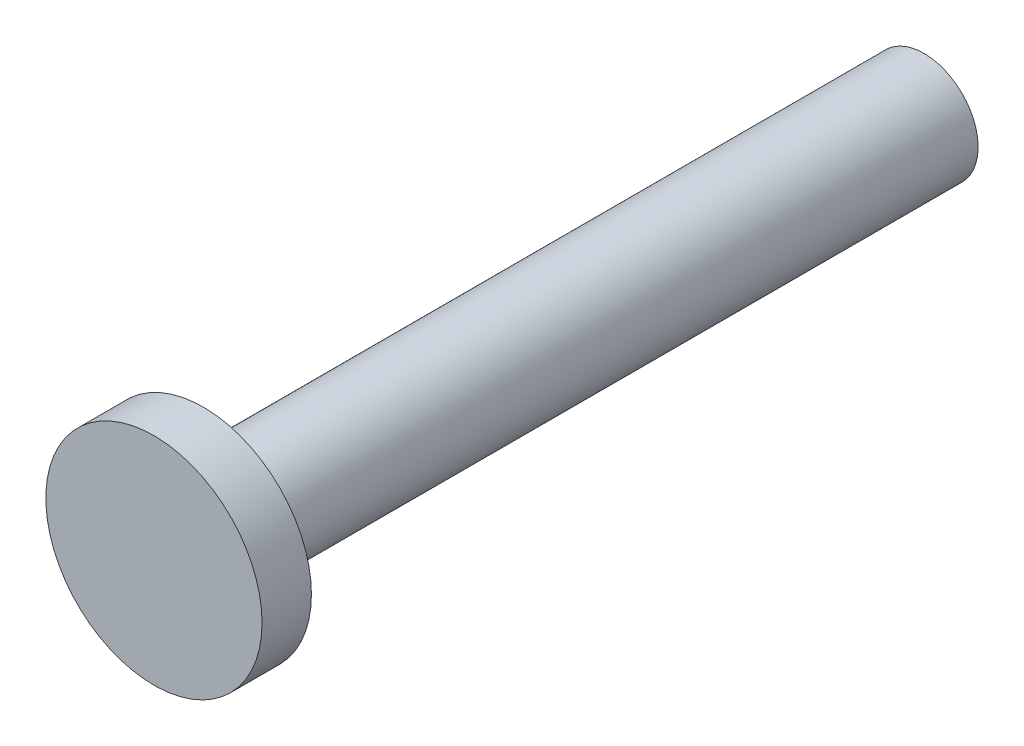
ISO-10303-21;
HEADER;
FILE_DESCRIPTION(('STEP AP214'),'2;1');
FILE_NAME('part.step','',(''),(''),'','','');
FILE_SCHEMA(('AUTOMOTIVE_DESIGN { 1 0 10303 214 1 1 1 1 }'));
ENDSEC;
DATA;
#1=APPLICATION_CONTEXT('core data for automotive mechanical design processes');
#2=APPLICATION_PROTOCOL_DEFINITION('international standard','automotive_design',2000,#1);
#3=PRODUCT_CONTEXT('',#1,'mechanical');
#4=PRODUCT('Part','Part','',(#3));
#5=PRODUCT_RELATED_PRODUCT_CATEGORY('part','',(#4));
#6=PRODUCT_DEFINITION_FORMATION('','',#4);
#7=PRODUCT_DEFINITION_CONTEXT('part definition',#1,'design');
#8=PRODUCT_DEFINITION('design','',#6,#7);
#9=PRODUCT_DEFINITION_SHAPE('','',#8);
#10=(LENGTH_UNIT() NAMED_UNIT(*) SI_UNIT(.MILLI.,.METRE.));
#11=(NAMED_UNIT(*) PLANE_ANGLE_UNIT() SI_UNIT($,.RADIAN.));
#12=(NAMED_UNIT(*) SI_UNIT($,.STERADIAN.) SOLID_ANGLE_UNIT());
#13=UNCERTAINTY_MEASURE_WITH_UNIT(LENGTH_MEASURE(1.E-05),#10,'distance_accuracy_value','');
#14=(GEOMETRIC_REPRESENTATION_CONTEXT(3) GLOBAL_UNCERTAINTY_ASSIGNED_CONTEXT((#13)) GLOBAL_UNIT_ASSIGNED_CONTEXT((#10,
#11,#12)) REPRESENTATION_CONTEXT('',''));
#15=CARTESIAN_POINT('',(0.,0.,0.));
#16=DIRECTION('',(0.,0.,1.));
#17=DIRECTION('',(1.,0.,0.));
#18=AXIS2_PLACEMENT_3D('',#15,#16,#17);
#19=CARTESIAN_POINT('',(0.,0.,1.37));
#20=DIRECTION('',(0.,0.,-1.));
#21=DIRECTION('',(-1.,0.,0.));
#22=AXIS2_PLACEMENT_3D('',#19,#20,#21);
#23=CYLINDRICAL_SURFACE('',#22,3.);
#24=CARTESIAN_POINT('',(0.,0.,1.37));
#25=DIRECTION('',(0.,0.,1.));
#26=DIRECTION('',(1.,0.,0.));
#27=AXIS2_PLACEMENT_3D('',#24,#25,#26);
#28=CIRCLE('',#27,3.);
#29=CARTESIAN_POINT('',(3.,0.,1.37));
#30=VERTEX_POINT('',#29);
#31=EDGE_CURVE('E38',#30,#30,#28,.T.);
#32=ORIENTED_EDGE('',*,*,#31,.F.);
#33=EDGE_LOOP('',(#32));
#34=FACE_BOUND('',#33,.T.);
#35=CARTESIAN_POINT('',(0.,0.,0.));
#36=DIRECTION('',(0.,0.,1.));
#37=DIRECTION('',(1.,0.,0.));
#38=AXIS2_PLACEMENT_3D('',#35,#36,#37);
#39=CIRCLE('',#38,3.);
#40=CARTESIAN_POINT('',(3.,0.,0.));
#41=VERTEX_POINT('',#40);
#42=EDGE_CURVE('E34',#41,#41,#39,.T.);
#43=ORIENTED_EDGE('',*,*,#42,.T.);
#44=EDGE_LOOP('',(#43));
#45=FACE_BOUND('',#44,.T.);
#46=ADVANCED_FACE('F31',(#34,#45),#23,.T.);
#47=CARTESIAN_POINT('',(0.,0.,1.37));
#48=DIRECTION('',(0.,0.,1.));
#49=DIRECTION('',(1.,0.,0.));
#50=AXIS2_PLACEMENT_3D('',#47,#48,#49);
#51=PLANE('',#50);
#52=ORIENTED_EDGE('',*,*,#31,.T.);
#53=EDGE_LOOP('',(#52));
#54=FACE_BOUND('',#53,.T.);
#55=ADVANCED_FACE('F55',(#54),#51,.T.);
#56=CARTESIAN_POINT('',(0.,0.,0.));
#57=DIRECTION('',(0.,0.,1.));
#58=DIRECTION('',(1.,0.,0.));
#59=AXIS2_PLACEMENT_3D('',#56,#57,#58);
#60=PLANE('',#59);
#61=CARTESIAN_POINT('',(0.,0.,0.));
#62=DIRECTION('',(0.,0.,-1.));
#63=DIRECTION('',(-1.,0.,0.));
#64=AXIS2_PLACEMENT_3D('',#61,#62,#63);
#65=CIRCLE('',#64,1.5);
#66=CARTESIAN_POINT('',(-1.5,0.,0.));
#67=VERTEX_POINT('',#66);
#68=EDGE_CURVE('E10',#67,#67,#65,.T.);
#69=ORIENTED_EDGE('',*,*,#68,.F.);
#70=EDGE_LOOP('',(#69));
#71=FACE_BOUND('',#70,.T.);
#72=ORIENTED_EDGE('',*,*,#42,.F.);
#73=EDGE_LOOP('',(#72));
#74=FACE_BOUND('',#73,.T.);
#75=ADVANCED_FACE('F52',(#71,#74),#60,.F.);
#76=CARTESIAN_POINT('',(0.,0.,-20.));
#77=DIRECTION('',(0.,0.,1.));
#78=DIRECTION('',(1.,0.,0.));
#79=AXIS2_PLACEMENT_3D('',#76,#77,#78);
#80=CYLINDRICAL_SURFACE('',#79,1.5);
#81=CARTESIAN_POINT('',(0.,0.,-20.));
#82=DIRECTION('',(0.,0.,-1.));
#83=DIRECTION('',(-1.,0.,0.));
#84=AXIS2_PLACEMENT_3D('',#81,#82,#83);
#85=CIRCLE('',#84,1.5);
#86=CARTESIAN_POINT('',(-1.5,0.,-20.));
#87=VERTEX_POINT('',#86);
#88=EDGE_CURVE('E44',#87,#87,#85,.T.);
#89=ORIENTED_EDGE('',*,*,#88,.F.);
#90=EDGE_LOOP('',(#89));
#91=FACE_BOUND('',#90,.T.);
#92=ORIENTED_EDGE('',*,*,#68,.T.);
#93=EDGE_LOOP('',(#92));
#94=FACE_BOUND('',#93,.T.);
#95=ADVANCED_FACE('F54',(#91,#94),#80,.T.);
#96=CARTESIAN_POINT('',(0.,0.,-20.));
#97=DIRECTION('',(0.,0.,-1.));
#98=DIRECTION('',(-1.,0.,0.));
#99=AXIS2_PLACEMENT_3D('',#96,#97,#98);
#100=PLANE('',#99);
#101=ORIENTED_EDGE('',*,*,#88,.T.);
#102=EDGE_LOOP('',(#101));
#103=FACE_BOUND('',#102,.T.);
#104=ADVANCED_FACE('F61',(#103),#100,.T.);
#105=CLOSED_SHELL('',(#46,#55,#75,#95,#104));
#106=MANIFOLD_SOLID_BREP('B2',#105);
#107=ADVANCED_BREP_SHAPE_REPRESENTATION('',(#18,#106),#14);
#108=SHAPE_DEFINITION_REPRESENTATION(#9,#107);
ENDSEC;
END-ISO-10303-21;
